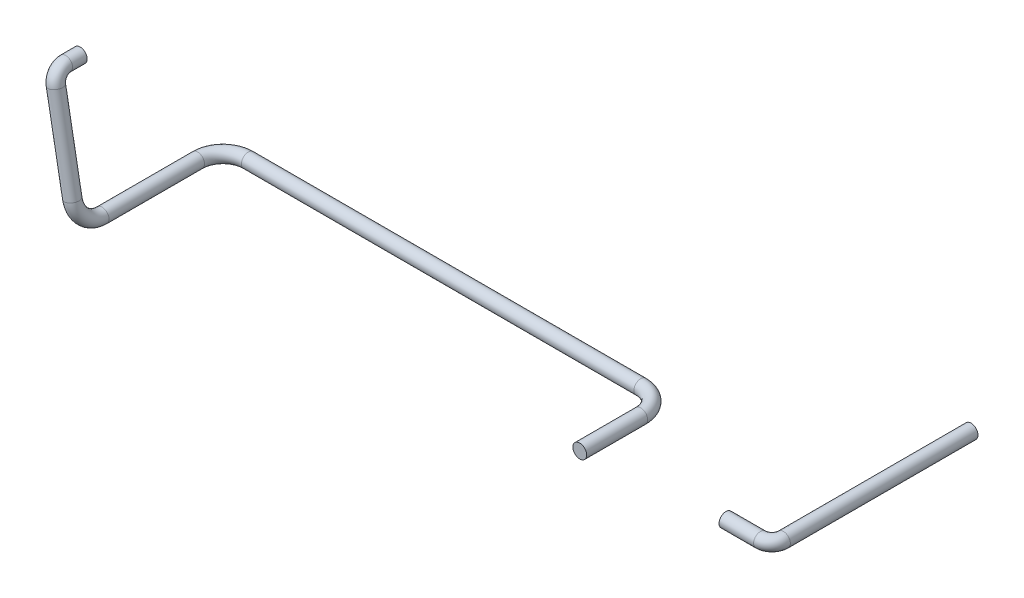
ISO-10303-21;
HEADER;
FILE_DESCRIPTION(('STEP AP214'),'2;1');
FILE_NAME('part.step','',(''),(''),'','','');
FILE_SCHEMA(('AUTOMOTIVE_DESIGN { 1 0 10303 214 1 1 1 1 }'));
ENDSEC;
DATA;
#1=APPLICATION_CONTEXT('core data for automotive mechanical design processes');
#2=APPLICATION_PROTOCOL_DEFINITION('international standard','automotive_design',2000,#1);
#3=PRODUCT_CONTEXT('',#1,'mechanical');
#4=PRODUCT('Part','Part','',(#3));
#5=PRODUCT_RELATED_PRODUCT_CATEGORY('part','',(#4));
#6=PRODUCT_DEFINITION_FORMATION('','',#4);
#7=PRODUCT_DEFINITION_CONTEXT('part definition',#1,'design');
#8=PRODUCT_DEFINITION('design','',#6,#7);
#9=PRODUCT_DEFINITION_SHAPE('','',#8);
#10=(LENGTH_UNIT() NAMED_UNIT(*) SI_UNIT(.MILLI.,.METRE.));
#11=(NAMED_UNIT(*) PLANE_ANGLE_UNIT() SI_UNIT($,.RADIAN.));
#12=(NAMED_UNIT(*) SI_UNIT($,.STERADIAN.) SOLID_ANGLE_UNIT());
#13=UNCERTAINTY_MEASURE_WITH_UNIT(LENGTH_MEASURE(1.E-05),#10,'distance_accuracy_value','');
#14=(GEOMETRIC_REPRESENTATION_CONTEXT(3) GLOBAL_UNCERTAINTY_ASSIGNED_CONTEXT((#13)) GLOBAL_UNIT_ASSIGNED_CONTEXT((#10,
#11,#12)) REPRESENTATION_CONTEXT('',''));
#15=CARTESIAN_POINT('',(0.,0.,0.));
#16=DIRECTION('',(0.,0.,1.));
#17=DIRECTION('',(1.,0.,0.));
#18=AXIS2_PLACEMENT_3D('',#15,#16,#17);
#19=CARTESIAN_POINT('',(855.,-60.,353.));
#20=DIRECTION('',(-1.,0.,0.));
#21=DIRECTION('',(0.,0.,1.));
#22=AXIS2_PLACEMENT_3D('',#19,#20,#21);
#23=PLANE('',#22);
#24=CARTESIAN_POINT('',(855.,-60.,353.));
#25=DIRECTION('',(-1.,0.,0.));
#26=DIRECTION('',(0.,0.,1.));
#27=AXIS2_PLACEMENT_3D('',#24,#25,#26);
#28=CIRCLE('',#27,6.00000000000001);
#29=CARTESIAN_POINT('',(855.,-60.,359.));
#30=VERTEX_POINT('',#29);
#31=EDGE_CURVE('E83',#30,#30,#28,.T.);
#32=ORIENTED_EDGE('',*,*,#31,.T.);
#33=EDGE_LOOP('',(#32));
#34=FACE_BOUND('',#33,.T.);
#35=ADVANCED_FACE('F72',(#34),#23,.T.);
#36=CARTESIAN_POINT('',(895.,-60.,180.));
#37=DIRECTION('',(0.,0.,1.));
#38=DIRECTION('',(1.,0.,0.));
#39=AXIS2_PLACEMENT_3D('',#36,#37,#38);
#40=PLANE('',#39);
#41=CARTESIAN_POINT('',(895.,-60.,180.));
#42=DIRECTION('',(0.,0.,1.));
#43=DIRECTION('',(1.,0.,0.));
#44=AXIS2_PLACEMENT_3D('',#41,#42,#43);
#45=CIRCLE('',#44,6.00000000000001);
#46=CARTESIAN_POINT('',(901.,-60.,180.));
#47=VERTEX_POINT('',#46);
#48=EDGE_CURVE('E12',#47,#47,#45,.T.);
#49=ORIENTED_EDGE('',*,*,#48,.F.);
#50=EDGE_LOOP('',(#49));
#51=FACE_BOUND('',#50,.T.);
#52=ADVANCED_FACE('F92',(#51),#40,.F.);
#53=CARTESIAN_POINT('',(855.,-60.,353.));
#54=DIRECTION('',(1.,0.,0.));
#55=DIRECTION('',(0.,0.,-1.));
#56=AXIS2_PLACEMENT_3D('',#53,#54,#55);
#57=CYLINDRICAL_SURFACE('',#56,6.00000000000001);
#58=CARTESIAN_POINT('',(885.,-60.,353.));
#59=DIRECTION('',(-1.,0.,0.));
#60=DIRECTION('',(0.,0.,1.));
#61=AXIS2_PLACEMENT_3D('',#58,#59,#60);
#62=CIRCLE('',#61,6.00000000000001);
#63=CARTESIAN_POINT('',(885.,-60.,359.));
#64=VERTEX_POINT('',#63);
#65=EDGE_CURVE('E82',#64,#64,#62,.T.);
#66=ORIENTED_EDGE('',*,*,#65,.T.);
#67=EDGE_LOOP('',(#66));
#68=FACE_BOUND('',#67,.T.);
#69=ORIENTED_EDGE('',*,*,#31,.F.);
#70=EDGE_LOOP('',(#69));
#71=FACE_BOUND('',#70,.T.);
#72=ADVANCED_FACE('F95',(#68,#71),#57,.T.);
#73=CARTESIAN_POINT('',(885.,-60.,343.));
#74=DIRECTION('',(0.,1.,0.));
#75=DIRECTION('',(0.,0.,1.));
#76=AXIS2_PLACEMENT_3D('',#73,#74,#75);
#77=TOROIDAL_SURFACE('',#76,10.,6.00000000000001);
#78=CARTESIAN_POINT('',(895.000000000001,-60.,342.999999999995));
#79=DIRECTION('',(0.,0.,1.));
#80=DIRECTION('',(1.,0.,0.));
#81=AXIS2_PLACEMENT_3D('',#78,#79,#80);
#82=CIRCLE('',#81,6.00000000000001);
#83=CARTESIAN_POINT('',(901.,-60.,342.999999999992));
#84=VERTEX_POINT('',#83);
#85=EDGE_CURVE('E80',#84,#84,#82,.T.);
#86=CARTESIAN_POINT('',(885.,-60.,343.));
#87=DIRECTION('',(0.,1.,0.));
#88=DIRECTION('',(0.,0.,1.));
#89=AXIS2_PLACEMENT_3D('',#86,#87,#88);
#90=CIRCLE('',#89,16.);
#91=EDGE_CURVE('',#64,#84,#90,.T.);
#92=ORIENTED_EDGE('',*,*,#65,.F.);
#93=ORIENTED_EDGE('',*,*,#85,.T.);
#94=ORIENTED_EDGE('',*,*,#91,.T.);
#95=ORIENTED_EDGE('',*,*,#91,.F.);
#96=EDGE_LOOP('',(#92,#94,#93,#95));
#97=FACE_BOUND('',#96,.T.);
#98=ADVANCED_FACE('F94',(#97),#77,.T.);
#99=CARTESIAN_POINT('',(895.,-60.,343.));
#100=DIRECTION('',(0.,0.,-1.));
#101=DIRECTION('',(-1.,0.,0.));
#102=AXIS2_PLACEMENT_3D('',#99,#100,#101);
#103=CYLINDRICAL_SURFACE('',#102,6.00000000000001);
#104=ORIENTED_EDGE('',*,*,#48,.T.);
#105=EDGE_LOOP('',(#104));
#106=FACE_BOUND('',#105,.T.);
#107=ORIENTED_EDGE('',*,*,#85,.F.);
#108=EDGE_LOOP('',(#107));
#109=FACE_BOUND('',#108,.T.);
#110=ADVANCED_FACE('F105',(#106,#109),#103,.T.);
#111=CLOSED_SHELL('',(#35,#52,#72,#98,#110));
#112=MANIFOLD_SOLID_BREP('B2',#111);
#113=CARTESIAN_POINT('',(285.,0.,344.));
#114=DIRECTION('',(0.,0.,-1.));
#115=DIRECTION('',(0.935999999999999,0.352000000000001,0.));
#116=AXIS2_PLACEMENT_3D('',#113,#114,#115);
#117=PLANE('',#116);
#118=CARTESIAN_POINT('',(285.,0.,344.));
#119=DIRECTION('',(0.,0.,-1.));
#120=DIRECTION('',(0.935999999999999,0.352000000000001,0.));
#121=AXIS2_PLACEMENT_3D('',#118,#119,#120);
#122=CIRCLE('',#121,6.00000000000001);
#123=CARTESIAN_POINT('',(290.616,2.11200000000003,344.));
#124=VERTEX_POINT('',#123);
#125=EDGE_CURVE('E177',#124,#124,#122,.T.);
#126=ORIENTED_EDGE('',*,*,#125,.T.);
#127=EDGE_LOOP('',(#126));
#128=FACE_BOUND('',#127,.T.);
#129=ADVANCED_FACE('F142',(#128),#117,.T.);
#130=CARTESIAN_POINT('',(690.,-110.,315.));
#131=DIRECTION('',(0.,0.,-1.));
#132=DIRECTION('',(-1.,0.,0.));
#133=AXIS2_PLACEMENT_3D('',#130,#131,#132);
#134=PLANE('',#133);
#135=CARTESIAN_POINT('',(690.,-110.,315.));
#136=DIRECTION('',(0.,0.,-1.));
#137=DIRECTION('',(-1.,0.,0.));
#138=AXIS2_PLACEMENT_3D('',#135,#136,#137);
#139=CIRCLE('',#138,6.00000000000001);
#140=CARTESIAN_POINT('',(684.,-110.,315.));
#141=VERTEX_POINT('',#140);
#142=EDGE_CURVE('E68',#141,#141,#139,.T.);
#143=ORIENTED_EDGE('',*,*,#142,.F.);
#144=EDGE_LOOP('',(#143));
#145=FACE_BOUND('',#144,.T.);
#146=ADVANCED_FACE('F184',(#145),#134,.F.);
#147=CARTESIAN_POINT('',(285.,0.,344.));
#148=DIRECTION('',(0.,0.,1.));
#149=DIRECTION('',(1.,0.,0.));
#150=AXIS2_PLACEMENT_3D('',#147,#148,#149);
#151=CYLINDRICAL_SURFACE('',#150,6.00000000000001);
#152=CARTESIAN_POINT('',(285.,0.,356.65));
#153=DIRECTION('',(0.,0.,-1.));
#154=DIRECTION('',(0.935999999999999,0.352000000000001,0.));
#155=AXIS2_PLACEMENT_3D('',#152,#153,#154);
#156=CIRCLE('',#155,6.00000000000001);
#157=CARTESIAN_POINT('',(283.9266873708,5.9032194605995,356.65));
#158=VERTEX_POINT('',#157);
#159=EDGE_CURVE('E174',#158,#158,#156,.T.);
#160=ORIENTED_EDGE('',*,*,#159,.T.);
#161=EDGE_LOOP('',(#160));
#162=FACE_BOUND('',#161,.T.);
#163=ORIENTED_EDGE('',*,*,#125,.F.);
#164=EDGE_LOOP('',(#163));
#165=FACE_BOUND('',#164,.T.);
#166=ADVANCED_FACE('F182',(#162,#165),#151,.T.);
#167=CARTESIAN_POINT('',(286.85146428537,-10.1830535695341,356.65));
#168=DIRECTION('',(0.983869910099907,0.178885438199984,0.));
#169=DIRECTION('',(-0.178885438199984,0.983869910099907,0.));
#170=AXIS2_PLACEMENT_3D('',#167,#168,#169);
#171=TOROIDAL_SURFACE('',#170,10.35,6.00000000000001);
#172=CARTESIAN_POINT('',(286.85146428537,-10.183053569534,367.));
#173=DIRECTION('',(-0.178885438199984,0.983869910099907,0.));
#174=DIRECTION('',(0.967999999999999,0.176000000000001,0.178885438199983));
#175=AXIS2_PLACEMENT_3D('',#172,#173,#174);
#176=CIRCLE('',#175,6.00000000000001);
#177=CARTESIAN_POINT('',(286.85146428537,-10.1830535695339,373.));
#178=VERTEX_POINT('',#177);
#179=EDGE_CURVE('E168',#178,#178,#176,.T.);
#180=CARTESIAN_POINT('',(286.85146428537,-10.1830535695341,356.65));
#181=DIRECTION('',(0.983869910099907,0.178885438199984,0.));
#182=DIRECTION('',(-0.178885438199984,0.983869910099907,0.));
#183=AXIS2_PLACEMENT_3D('',#180,#181,#182);
#184=CIRCLE('',#183,16.3500000000001);
#185=EDGE_CURVE('',#158,#178,#184,.T.);
#186=ORIENTED_EDGE('',*,*,#159,.F.);
#187=ORIENTED_EDGE('',*,*,#179,.T.);
#188=ORIENTED_EDGE('',*,*,#185,.T.);
#189=ORIENTED_EDGE('',*,*,#185,.F.);
#190=EDGE_LOOP('',(#186,#188,#187,#189));
#191=FACE_BOUND('',#190,.T.);
#192=ADVANCED_FACE('F181',(#191),#171,.T.);
#193=CARTESIAN_POINT('',(286.85146428537,-10.183053569534,367.));
#194=DIRECTION('',(0.178885438199983,-0.983869910099908,0.));
#195=DIRECTION('',(0.983869910099908,0.178885438199983,0.));
#196=AXIS2_PLACEMENT_3D('',#193,#194,#195);
#197=CYLINDRICAL_SURFACE('',#196,6.00000000000001);
#198=CARTESIAN_POINT('',(301.0645203596,-88.3548619778021,367.));
#199=DIRECTION('',(-0.178885438199983,0.983869910099908,0.));
#200=DIRECTION('',(0.968,0.176,0.178885438199983));
#201=AXIS2_PLACEMENT_3D('',#198,#199,#200);
#202=CIRCLE('',#201,6.00000000000001);
#203=CARTESIAN_POINT('',(301.0645203596,-88.3548619778021,373.));
#204=VERTEX_POINT('',#203);
#205=EDGE_CURVE('E170',#204,#204,#202,.T.);
#206=ORIENTED_EDGE('',*,*,#205,.T.);
#207=EDGE_LOOP('',(#206));
#208=FACE_BOUND('',#207,.T.);
#209=ORIENTED_EDGE('',*,*,#179,.F.);
#210=EDGE_LOOP('',(#209));
#211=FACE_BOUND('',#210,.T.);
#212=ADVANCED_FACE('F192',(#208,#211),#197,.T.);
#213=CARTESIAN_POINT('',(301.0645203596,-88.354861977802,345.));
#214=DIRECTION('',(0.983869910099908,0.178885438199983,0.));
#215=DIRECTION('',(-0.178885438199983,0.983869910099908,0.));
#216=AXIS2_PLACEMENT_3D('',#213,#214,#215);
#217=TOROIDAL_SURFACE('',#216,22.,6.00000000000001);
#218=CARTESIAN_POINT('',(305.,-110.,345.));
#219=DIRECTION('',(0.,0.,1.));
#220=DIRECTION('',(1.,0.,0.));
#221=AXIS2_PLACEMENT_3D('',#218,#219,#220);
#222=CIRCLE('',#221,6.00000000000001);
#223=CARTESIAN_POINT('',(306.0733126292,-115.9032194606,345.));
#224=VERTEX_POINT('',#223);
#225=EDGE_CURVE('E163',#224,#224,#222,.T.);
#226=CARTESIAN_POINT('',(301.0645203596,-88.354861977802,345.));
#227=DIRECTION('',(0.983869910099908,0.178885438199983,0.));
#228=DIRECTION('',(-0.178885438199983,0.983869910099908,0.));
#229=AXIS2_PLACEMENT_3D('',#226,#227,#228);
#230=CIRCLE('',#229,28.);
#231=EDGE_CURVE('',#204,#224,#230,.T.);
#232=ORIENTED_EDGE('',*,*,#205,.F.);
#233=ORIENTED_EDGE('',*,*,#225,.T.);
#234=ORIENTED_EDGE('',*,*,#231,.T.);
#235=ORIENTED_EDGE('',*,*,#231,.F.);
#236=EDGE_LOOP('',(#232,#234,#233,#235));
#237=FACE_BOUND('',#236,.T.);
#238=ADVANCED_FACE('F216',(#237),#217,.T.);
#239=CARTESIAN_POINT('',(305.,-110.,345.));
#240=DIRECTION('',(0.,0.,-1.));
#241=DIRECTION('',(-1.,0.,0.));
#242=AXIS2_PLACEMENT_3D('',#239,#240,#241);
#243=CYLINDRICAL_SURFACE('',#242,6.00000000000001);
#244=CARTESIAN_POINT('',(305.,-110.,262.));
#245=DIRECTION('',(0.,0.,1.));
#246=DIRECTION('',(1.,0.,0.));
#247=AXIS2_PLACEMENT_3D('',#244,#245,#246);
#248=CIRCLE('',#247,6.00000000000001);
#249=CARTESIAN_POINT('',(299.,-110.,262.));
#250=VERTEX_POINT('',#249);
#251=EDGE_CURVE('E161',#250,#250,#248,.T.);
#252=ORIENTED_EDGE('',*,*,#251,.T.);
#253=EDGE_LOOP('',(#252));
#254=FACE_BOUND('',#253,.T.);
#255=ORIENTED_EDGE('',*,*,#225,.F.);
#256=EDGE_LOOP('',(#255));
#257=FACE_BOUND('',#256,.T.);
#258=ADVANCED_FACE('F215',(#254,#257),#243,.T.);
#259=CARTESIAN_POINT('',(327.,-110.,262.));
#260=DIRECTION('',(0.,-1.,0.));
#261=DIRECTION('',(0.,0.,-1.));
#262=AXIS2_PLACEMENT_3D('',#259,#260,#261);
#263=TOROIDAL_SURFACE('',#262,22.0000000000002,6.00000000000001);
#264=CARTESIAN_POINT('',(327.,-110.,240.));
#265=DIRECTION('',(-1.,0.,0.));
#266=DIRECTION('',(0.,0.,1.));
#267=AXIS2_PLACEMENT_3D('',#264,#265,#266);
#268=CIRCLE('',#267,6.00000000000001);
#269=CARTESIAN_POINT('',(327.,-110.,234.));
#270=VERTEX_POINT('',#269);
#271=EDGE_CURVE('E156',#270,#270,#268,.T.);
#272=CARTESIAN_POINT('',(327.,-110.,262.));
#273=DIRECTION('',(0.,-1.,0.));
#274=DIRECTION('',(0.,0.,-1.));
#275=AXIS2_PLACEMENT_3D('',#272,#273,#274);
#276=CIRCLE('',#275,28.0000000000002);
#277=EDGE_CURVE('',#250,#270,#276,.T.);
#278=ORIENTED_EDGE('',*,*,#251,.F.);
#279=ORIENTED_EDGE('',*,*,#271,.T.);
#280=ORIENTED_EDGE('',*,*,#277,.T.);
#281=ORIENTED_EDGE('',*,*,#277,.F.);
#282=EDGE_LOOP('',(#278,#280,#279,#281));
#283=FACE_BOUND('',#282,.T.);
#284=ADVANCED_FACE('F208',(#283),#263,.T.);
#285=CARTESIAN_POINT('',(327.,-110.,240.));
#286=DIRECTION('',(1.,0.,0.));
#287=DIRECTION('',(0.,0.,-1.));
#288=AXIS2_PLACEMENT_3D('',#285,#286,#287);
#289=CYLINDRICAL_SURFACE('',#288,6.00000000000001);
#290=CARTESIAN_POINT('',(668.,-110.,240.));
#291=DIRECTION('',(-1.,0.,0.));
#292=DIRECTION('',(0.,0.,1.));
#293=AXIS2_PLACEMENT_3D('',#290,#291,#292);
#294=CIRCLE('',#293,6.00000000000001);
#295=CARTESIAN_POINT('',(668.,-110.,234.));
#296=VERTEX_POINT('',#295);
#297=EDGE_CURVE('E155',#296,#296,#294,.T.);
#298=CARTESIAN_POINT('',(668.,-110.,234.));
#299=CARTESIAN_POINT('',(664.447916666667,-110.,234.));
#300=CARTESIAN_POINT('',(660.895833333333,-110.,234.));
#301=CARTESIAN_POINT('',(653.791666666667,-110.,234.));
#302=CARTESIAN_POINT('',(650.239583333333,-110.,234.));
#303=CARTESIAN_POINT('',(643.135416666667,-110.,234.));
#304=CARTESIAN_POINT('',(639.583333333333,-110.,234.));
#305=CARTESIAN_POINT('',(632.479166666667,-110.,234.));
#306=CARTESIAN_POINT('',(628.927083333333,-110.,234.));
#307=CARTESIAN_POINT('',(621.822916666666,-110.,234.));
#308=CARTESIAN_POINT('',(618.270833333333,-110.,234.));
#309=CARTESIAN_POINT('',(611.166666666667,-110.,234.));
#310=CARTESIAN_POINT('',(607.614583333333,-110.,234.));
#311=CARTESIAN_POINT('',(600.510416666667,-110.,234.));
#312=CARTESIAN_POINT('',(596.958333333333,-110.,234.));
#313=CARTESIAN_POINT('',(589.854166666667,-110.,234.));
#314=CARTESIAN_POINT('',(586.302083333333,-110.,234.));
#315=CARTESIAN_POINT('',(579.197916666667,-110.,234.));
#316=CARTESIAN_POINT('',(575.645833333333,-110.,234.));
#317=CARTESIAN_POINT('',(568.541666666667,-110.,234.));
#318=CARTESIAN_POINT('',(564.989583333333,-110.,234.));
#319=CARTESIAN_POINT('',(557.885416666667,-110.,234.));
#320=CARTESIAN_POINT('',(554.333333333333,-110.,234.));
#321=CARTESIAN_POINT('',(547.229166666667,-110.,234.));
#322=CARTESIAN_POINT('',(543.677083333333,-110.,234.));
#323=CARTESIAN_POINT('',(536.572916666667,-110.,234.));
#324=CARTESIAN_POINT('',(533.020833333333,-110.,234.));
#325=CARTESIAN_POINT('',(525.916666666667,-110.,234.));
#326=CARTESIAN_POINT('',(522.364583333333,-110.,234.));
#327=CARTESIAN_POINT('',(515.260416666667,-110.,234.));
#328=CARTESIAN_POINT('',(511.708333333333,-110.,234.));
#329=CARTESIAN_POINT('',(504.604166666667,-110.,234.));
#330=CARTESIAN_POINT('',(501.052083333333,-110.,234.));
#331=CARTESIAN_POINT('',(493.947916666667,-110.,234.));
#332=CARTESIAN_POINT('',(490.395833333333,-110.,234.));
#333=CARTESIAN_POINT('',(483.291666666667,-110.,234.));
#334=CARTESIAN_POINT('',(479.739583333333,-110.,234.));
#335=CARTESIAN_POINT('',(472.635416666667,-110.,234.));
#336=CARTESIAN_POINT('',(469.083333333333,-110.,234.));
#337=CARTESIAN_POINT('',(461.979166666667,-110.,234.));
#338=CARTESIAN_POINT('',(458.427083333333,-110.,234.));
#339=CARTESIAN_POINT('',(451.322916666667,-110.,234.));
#340=CARTESIAN_POINT('',(447.770833333333,-110.,234.));
#341=CARTESIAN_POINT('',(440.666666666667,-110.,234.));
#342=CARTESIAN_POINT('',(437.114583333333,-110.,234.));
#343=CARTESIAN_POINT('',(430.010416666667,-110.,234.));
#344=CARTESIAN_POINT('',(426.458333333333,-110.,234.));
#345=CARTESIAN_POINT('',(419.354166666667,-110.,234.));
#346=CARTESIAN_POINT('',(415.802083333333,-110.,234.));
#347=CARTESIAN_POINT('',(408.697916666667,-110.,234.));
#348=CARTESIAN_POINT('',(405.145833333333,-110.,234.));
#349=CARTESIAN_POINT('',(398.041666666667,-110.,234.));
#350=CARTESIAN_POINT('',(394.489583333333,-110.,234.));
#351=CARTESIAN_POINT('',(387.385416666667,-110.,234.));
#352=CARTESIAN_POINT('',(383.833333333333,-110.,234.));
#353=CARTESIAN_POINT('',(376.729166666667,-110.,234.));
#354=CARTESIAN_POINT('',(373.177083333333,-110.,234.));
#355=CARTESIAN_POINT('',(366.072916666667,-110.,234.));
#356=CARTESIAN_POINT('',(362.520833333333,-110.,234.));
#357=CARTESIAN_POINT('',(355.416666666667,-110.,234.));
#358=CARTESIAN_POINT('',(351.864583333333,-110.,234.));
#359=CARTESIAN_POINT('',(344.760416666667,-110.,234.));
#360=CARTESIAN_POINT('',(341.208333333333,-110.,234.));
#361=CARTESIAN_POINT('',(334.104166666667,-110.,234.));
#362=CARTESIAN_POINT('',(330.552083333333,-110.,234.));
#363=CARTESIAN_POINT('',(327.,-110.,234.));
#364=B_SPLINE_CURVE_WITH_KNOTS('',3,(#298,#299,#300,#301,#302,#303,#304,#305,#306,#307,#308,
#309,#310,#311,#312,#313,#314,#315,#316,#317,#318,#319,#320,#321,#322,#323,#324,#325,#326,#327,
#328,#329,#330,#331,#332,#333,#334,#335,#336,#337,#338,#339,#340,#341,#342,#343,#344,#345,#346,
#347,#348,#349,#350,#351,#352,#353,#354,#355,#356,#357,#358,#359,#360,#361,#362,#363),
.UNSPECIFIED.,.F.,.F.,(4,2,2,2,2,2,2,2,2,2,2,2,2,2,2,2,2,2,2,2,2,2,2,2,2,2,2,2,2,2,2,2,4),(0.,
10.6562499999999,21.3125,31.96875,42.625,53.2812499999999,63.9375,74.5937499999999,
85.2499999999999,95.90625,106.5625,117.21875,127.875,138.53125,149.1875,159.84375,170.5,
181.15625,191.8125,202.46875,213.125,223.78125,234.4375,245.09375,255.75,266.40625,277.0625,
287.71875,298.375,309.03125,319.6875,330.34375,341.),.UNSPECIFIED.);
#365=EDGE_CURVE('BSEAM205',#296,#270,#364,.T.);
#366=ORIENTED_EDGE('',*,*,#297,.T.);
#367=ORIENTED_EDGE('',*,*,#271,.F.);
#368=ORIENTED_EDGE('',*,*,#365,.T.);
#369=ORIENTED_EDGE('',*,*,#365,.F.);
#370=EDGE_LOOP('',(#366,#368,#367,#369));
#371=FACE_BOUND('',#370,.T.);
#372=ADVANCED_FACE('F205',(#371),#289,.T.);
#373=CARTESIAN_POINT('',(668.,-110.,262.));
#374=DIRECTION('',(0.,-1.,0.));
#375=DIRECTION('',(0.,0.,-1.));
#376=AXIS2_PLACEMENT_3D('',#373,#374,#375);
#377=TOROIDAL_SURFACE('',#376,22.0000000000001,6.00000000000001);
#378=CARTESIAN_POINT('',(689.999999999999,-110.,262.000000000002));
#379=DIRECTION('',(0.,0.,-1.));
#380=DIRECTION('',(-1.,0.,0.));
#381=AXIS2_PLACEMENT_3D('',#378,#379,#380);
#382=CIRCLE('',#381,6.00000000000001);
#383=CARTESIAN_POINT('',(696.,-110.,262.000000000002));
#384=VERTEX_POINT('',#383);
#385=EDGE_CURVE('E146',#384,#384,#382,.T.);
#386=CARTESIAN_POINT('',(668.,-110.,262.));
#387=DIRECTION('',(0.,-1.,0.));
#388=DIRECTION('',(0.,0.,-1.));
#389=AXIS2_PLACEMENT_3D('',#386,#387,#388);
#390=CIRCLE('',#389,28.0000000000001);
#391=EDGE_CURVE('',#296,#384,#390,.T.);
#392=ORIENTED_EDGE('',*,*,#297,.F.);
#393=ORIENTED_EDGE('',*,*,#385,.T.);
#394=ORIENTED_EDGE('',*,*,#391,.T.);
#395=ORIENTED_EDGE('',*,*,#391,.F.);
#396=EDGE_LOOP('',(#392,#394,#393,#395));
#397=FACE_BOUND('',#396,.T.);
#398=ADVANCED_FACE('F197',(#397),#377,.T.);
#399=CARTESIAN_POINT('',(690.,-110.,262.));
#400=DIRECTION('',(0.,0.,1.));
#401=DIRECTION('',(1.,0.,0.));
#402=AXIS2_PLACEMENT_3D('',#399,#400,#401);
#403=CYLINDRICAL_SURFACE('',#402,6.00000000000001);
#404=ORIENTED_EDGE('',*,*,#142,.T.);
#405=EDGE_LOOP('',(#404));
#406=FACE_BOUND('',#405,.T.);
#407=ORIENTED_EDGE('',*,*,#385,.F.);
#408=EDGE_LOOP('',(#407));
#409=FACE_BOUND('',#408,.T.);
#410=ADVANCED_FACE('F193',(#406,#409),#403,.T.);
#411=CLOSED_SHELL('',(#129,#146,#166,#192,#212,#238,#258,#284,#372,#398,#410));
#412=MANIFOLD_SOLID_BREP('B7',#411);
#413=ADVANCED_BREP_SHAPE_REPRESENTATION('',(#18,#112,#412),#14);
#414=SHAPE_DEFINITION_REPRESENTATION(#9,#413);
ENDSEC;
END-ISO-10303-21;
